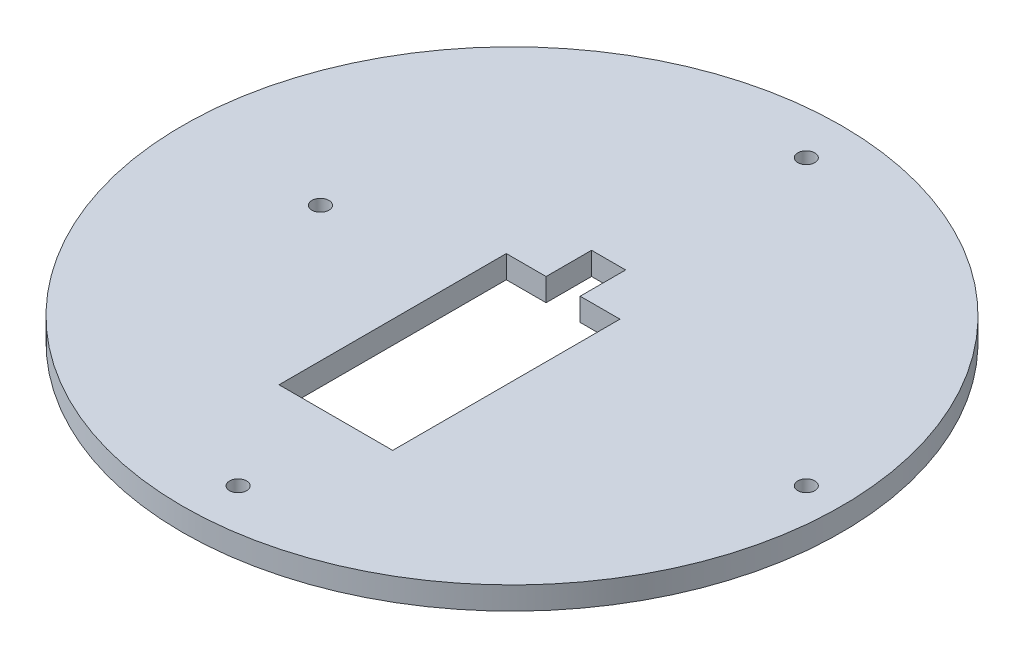
ISO-10303-21;
HEADER;
FILE_DESCRIPTION(('STEP AP214'),'2;1');
FILE_NAME('part.step','',(''),(''),'','','');
FILE_SCHEMA(('AUTOMOTIVE_DESIGN { 1 0 10303 214 1 1 1 1 }'));
ENDSEC;
DATA;
#1=APPLICATION_CONTEXT('core data for automotive mechanical design processes');
#2=APPLICATION_PROTOCOL_DEFINITION('international standard','automotive_design',2000,#1);
#3=PRODUCT_CONTEXT('',#1,'mechanical');
#4=PRODUCT('Part','Part','',(#3));
#5=PRODUCT_RELATED_PRODUCT_CATEGORY('part','',(#4));
#6=PRODUCT_DEFINITION_FORMATION('','',#4);
#7=PRODUCT_DEFINITION_CONTEXT('part definition',#1,'design');
#8=PRODUCT_DEFINITION('design','',#6,#7);
#9=PRODUCT_DEFINITION_SHAPE('','',#8);
#10=(LENGTH_UNIT() NAMED_UNIT(*) SI_UNIT(.MILLI.,.METRE.));
#11=(NAMED_UNIT(*) PLANE_ANGLE_UNIT() SI_UNIT($,.RADIAN.));
#12=(NAMED_UNIT(*) SI_UNIT($,.STERADIAN.) SOLID_ANGLE_UNIT());
#13=UNCERTAINTY_MEASURE_WITH_UNIT(LENGTH_MEASURE(1.E-05),#10,'distance_accuracy_value','');
#14=(GEOMETRIC_REPRESENTATION_CONTEXT(3) GLOBAL_UNCERTAINTY_ASSIGNED_CONTEXT((#13)) GLOBAL_UNIT_ASSIGNED_CONTEXT((#10,
#11,#12)) REPRESENTATION_CONTEXT('',''));
#15=CARTESIAN_POINT('',(0.,0.,0.));
#16=DIRECTION('',(0.,0.,1.));
#17=DIRECTION('',(1.,0.,0.));
#18=AXIS2_PLACEMENT_3D('',#15,#16,#17);
#19=CARTESIAN_POINT('',(0.,4.,0.));
#20=DIRECTION('',(0.,-1.,0.));
#21=DIRECTION('',(0.,0.,-1.));
#22=AXIS2_PLACEMENT_3D('',#19,#20,#21);
#23=CYLINDRICAL_SURFACE('',#22,58.);
#24=CARTESIAN_POINT('',(0.,4.,0.));
#25=DIRECTION('',(0.,1.,0.));
#26=DIRECTION('',(0.,0.,1.));
#27=AXIS2_PLACEMENT_3D('',#24,#25,#26);
#28=CIRCLE('',#27,58.);
#29=CARTESIAN_POINT('',(0.,4.,58.));
#30=VERTEX_POINT('',#29);
#31=EDGE_CURVE('E174',#30,#30,#28,.T.);
#32=ORIENTED_EDGE('',*,*,#31,.F.);
#33=EDGE_LOOP('',(#32));
#34=FACE_BOUND('',#33,.T.);
#35=CARTESIAN_POINT('',(0.,0.,0.));
#36=DIRECTION('',(0.,1.,0.));
#37=DIRECTION('',(0.,0.,1.));
#38=AXIS2_PLACEMENT_3D('',#35,#36,#37);
#39=CIRCLE('',#38,58.);
#40=CARTESIAN_POINT('',(0.,0.,58.));
#41=VERTEX_POINT('',#40);
#42=EDGE_CURVE('E173',#41,#41,#39,.T.);
#43=ORIENTED_EDGE('',*,*,#42,.T.);
#44=EDGE_LOOP('',(#43));
#45=FACE_BOUND('',#44,.T.);
#46=ADVANCED_FACE('F36',(#34,#45),#23,.T.);
#47=CARTESIAN_POINT('',(0.,4.,0.));
#48=DIRECTION('',(0.,1.,0.));
#49=DIRECTION('',(0.,0.,1.));
#50=AXIS2_PLACEMENT_3D('',#47,#48,#49);
#51=PLANE('',#50);
#52=DIRECTION('',(0.,0.,-1.));
#53=VECTOR('',#52,1.);
#54=CARTESIAN_POINT('',(10.,4.,31.));
#55=LINE('',#54,#53);
#56=CARTESIAN_POINT('',(10.,4.,31.));
#57=VERTEX_POINT('',#56);
#58=CARTESIAN_POINT('',(10.,4.,-9.));
#59=VERTEX_POINT('',#58);
#60=EDGE_CURVE('E50',#57,#59,#55,.T.);
#61=ORIENTED_EDGE('',*,*,#60,.F.);
#62=DIRECTION('',(1.,0.,0.));
#63=VECTOR('',#62,1.);
#64=CARTESIAN_POINT('',(-9.99999999999997,4.,31.));
#65=LINE('',#64,#63);
#66=CARTESIAN_POINT('',(-9.99999999999997,4.,31.));
#67=VERTEX_POINT('',#66);
#68=EDGE_CURVE('E134',#67,#57,#65,.T.);
#69=ORIENTED_EDGE('',*,*,#68,.F.);
#70=DIRECTION('',(0.,0.,1.));
#71=VECTOR('',#70,1.);
#72=CARTESIAN_POINT('',(-9.99999999999997,4.,31.));
#73=LINE('',#72,#71);
#74=CARTESIAN_POINT('',(-9.99999999999997,4.,-9.));
#75=VERTEX_POINT('',#74);
#76=EDGE_CURVE('E131',#75,#67,#73,.T.);
#77=ORIENTED_EDGE('',*,*,#76,.F.);
#78=DIRECTION('',(-1.,0.,0.));
#79=VECTOR('',#78,1.);
#80=CARTESIAN_POINT('',(-9.99999999999997,4.,-9.));
#81=LINE('',#80,#79);
#82=CARTESIAN_POINT('',(-2.99999999999997,4.,-9.));
#83=VERTEX_POINT('',#82);
#84=EDGE_CURVE('E128',#83,#75,#81,.T.);
#85=ORIENTED_EDGE('',*,*,#84,.F.);
#86=DIRECTION('',(0.,0.,1.));
#87=VECTOR('',#86,1.);
#88=CARTESIAN_POINT('',(-2.99999999999997,4.,-9.));
#89=LINE('',#88,#87);
#90=CARTESIAN_POINT('',(-2.99999999999997,4.,-17.));
#91=VERTEX_POINT('',#90);
#92=EDGE_CURVE('E122',#91,#83,#89,.T.);
#93=ORIENTED_EDGE('',*,*,#92,.F.);
#94=DIRECTION('',(-1.,0.,0.));
#95=VECTOR('',#94,1.);
#96=CARTESIAN_POINT('',(-2.99999999999997,4.,-17.));
#97=LINE('',#96,#95);
#98=CARTESIAN_POINT('',(3.00000000000003,4.,-17.));
#99=VERTEX_POINT('',#98);
#100=EDGE_CURVE('E120',#99,#91,#97,.T.);
#101=ORIENTED_EDGE('',*,*,#100,.F.);
#102=DIRECTION('',(0.,0.,-1.));
#103=VECTOR('',#102,1.);
#104=CARTESIAN_POINT('',(3.00000000000003,4.,-9.));
#105=LINE('',#104,#103);
#106=CARTESIAN_POINT('',(3.00000000000003,4.,-9.));
#107=VERTEX_POINT('',#106);
#108=EDGE_CURVE('E103',#107,#99,#105,.T.);
#109=ORIENTED_EDGE('',*,*,#108,.F.);
#110=DIRECTION('',(-1.,0.,0.));
#111=VECTOR('',#110,1.);
#112=CARTESIAN_POINT('',(3.00000000000003,4.,-9.));
#113=LINE('',#112,#111);
#114=EDGE_CURVE('E112',#59,#107,#113,.T.);
#115=ORIENTED_EDGE('',*,*,#114,.F.);
#116=EDGE_LOOP('',(#61,#69,#77,#85,#93,#101,#109,#115));
#117=FACE_BOUND('',#116,.T.);
#118=CARTESIAN_POINT('',(1.79336649678,4.,-50.));
#119=DIRECTION('',(0.,1.,0.));
#120=DIRECTION('',(0.,0.,1.));
#121=AXIS2_PLACEMENT_3D('',#118,#119,#120);
#122=CIRCLE('',#121,1.5);
#123=CARTESIAN_POINT('',(1.79336649678,4.,-48.5));
#124=VERTEX_POINT('',#123);
#125=EDGE_CURVE('E170',#124,#124,#122,.T.);
#126=ORIENTED_EDGE('',*,*,#125,.F.);
#127=EDGE_LOOP('',(#126));
#128=FACE_BOUND('',#127,.T.);
#129=CARTESIAN_POINT('',(-33.70663350322,4.,0.));
#130=DIRECTION('',(0.,1.,0.));
#131=DIRECTION('',(0.,0.,1.));
#132=AXIS2_PLACEMENT_3D('',#129,#130,#131);
#133=CIRCLE('',#132,1.5);
#134=CARTESIAN_POINT('',(-33.70663350322,4.,1.5));
#135=VERTEX_POINT('',#134);
#136=EDGE_CURVE('E167',#135,#135,#133,.T.);
#137=ORIENTED_EDGE('',*,*,#136,.F.);
#138=EDGE_LOOP('',(#137));
#139=FACE_BOUND('',#138,.T.);
#140=CARTESIAN_POINT('',(1.79336649678,4.,50.));
#141=DIRECTION('',(0.,1.,0.));
#142=DIRECTION('',(0.,0.,1.));
#143=AXIS2_PLACEMENT_3D('',#140,#141,#142);
#144=CIRCLE('',#143,1.5);
#145=CARTESIAN_POINT('',(1.79336649678,4.,51.5));
#146=VERTEX_POINT('',#145);
#147=EDGE_CURVE('E164',#146,#146,#144,.T.);
#148=ORIENTED_EDGE('',*,*,#147,.F.);
#149=EDGE_LOOP('',(#148));
#150=FACE_BOUND('',#149,.T.);
#151=CARTESIAN_POINT('',(51.79336649678,4.,0.));
#152=DIRECTION('',(0.,1.,0.));
#153=DIRECTION('',(0.,0.,1.));
#154=AXIS2_PLACEMENT_3D('',#151,#152,#153);
#155=CIRCLE('',#154,1.5);
#156=CARTESIAN_POINT('',(51.79336649678,4.,1.5));
#157=VERTEX_POINT('',#156);
#158=EDGE_CURVE('E153',#157,#157,#155,.T.);
#159=ORIENTED_EDGE('',*,*,#158,.F.);
#160=EDGE_LOOP('',(#159));
#161=FACE_BOUND('',#160,.T.);
#162=ORIENTED_EDGE('',*,*,#31,.T.);
#163=EDGE_LOOP('',(#162));
#164=FACE_BOUND('',#163,.T.);
#165=ADVANCED_FACE('F116',(#117,#128,#139,#150,#161,#164),#51,.T.);
#166=CARTESIAN_POINT('',(0.,0.,0.));
#167=DIRECTION('',(0.,1.,0.));
#168=DIRECTION('',(0.,0.,1.));
#169=AXIS2_PLACEMENT_3D('',#166,#167,#168);
#170=PLANE('',#169);
#171=DIRECTION('',(1.,0.,0.));
#172=VECTOR('',#171,1.);
#173=CARTESIAN_POINT('',(0.,0.,31.));
#174=LINE('',#173,#172);
#175=CARTESIAN_POINT('',(-9.99999999999997,0.,31.));
#176=VERTEX_POINT('',#175);
#177=CARTESIAN_POINT('',(10.,0.,31.));
#178=VERTEX_POINT('',#177);
#179=EDGE_CURVE('E43',#176,#178,#174,.T.);
#180=ORIENTED_EDGE('',*,*,#179,.T.);
#181=DIRECTION('',(0.,0.,-1.));
#182=VECTOR('',#181,1.);
#183=CARTESIAN_POINT('',(10.,0.,0.));
#184=LINE('',#183,#182);
#185=CARTESIAN_POINT('',(10.,0.,-9.));
#186=VERTEX_POINT('',#185);
#187=EDGE_CURVE('E11',#178,#186,#184,.T.);
#188=ORIENTED_EDGE('',*,*,#187,.T.);
#189=DIRECTION('',(-1.,0.,0.));
#190=VECTOR('',#189,1.);
#191=CARTESIAN_POINT('',(0.,0.,-9.));
#192=LINE('',#191,#190);
#193=CARTESIAN_POINT('',(3.00000000000003,0.,-9.));
#194=VERTEX_POINT('',#193);
#195=EDGE_CURVE('E177',#186,#194,#192,.T.);
#196=ORIENTED_EDGE('',*,*,#195,.T.);
#197=DIRECTION('',(0.,0.,-1.));
#198=VECTOR('',#197,1.);
#199=CARTESIAN_POINT('',(3.00000000000003,0.,0.));
#200=LINE('',#199,#198);
#201=CARTESIAN_POINT('',(3.00000000000003,0.,-17.));
#202=VERTEX_POINT('',#201);
#203=EDGE_CURVE('E106',#194,#202,#200,.T.);
#204=ORIENTED_EDGE('',*,*,#203,.T.);
#205=DIRECTION('',(-1.,0.,0.));
#206=VECTOR('',#205,1.);
#207=CARTESIAN_POINT('',(0.,0.,-17.));
#208=LINE('',#207,#206);
#209=CARTESIAN_POINT('',(-2.99999999999997,0.,-17.));
#210=VERTEX_POINT('',#209);
#211=EDGE_CURVE('E182',#202,#210,#208,.T.);
#212=ORIENTED_EDGE('',*,*,#211,.T.);
#213=DIRECTION('',(0.,0.,1.));
#214=VECTOR('',#213,1.);
#215=CARTESIAN_POINT('',(-2.99999999999997,0.,0.));
#216=LINE('',#215,#214);
#217=CARTESIAN_POINT('',(-2.99999999999997,0.,-9.));
#218=VERTEX_POINT('',#217);
#219=EDGE_CURVE('E185',#210,#218,#216,.T.);
#220=ORIENTED_EDGE('',*,*,#219,.T.);
#221=DIRECTION('',(-1.,0.,0.));
#222=VECTOR('',#221,1.);
#223=CARTESIAN_POINT('',(0.,0.,-9.));
#224=LINE('',#223,#222);
#225=CARTESIAN_POINT('',(-9.99999999999997,0.,-9.));
#226=VERTEX_POINT('',#225);
#227=EDGE_CURVE('E188',#218,#226,#224,.T.);
#228=ORIENTED_EDGE('',*,*,#227,.T.);
#229=DIRECTION('',(0.,0.,1.));
#230=VECTOR('',#229,1.);
#231=CARTESIAN_POINT('',(-9.99999999999997,0.,0.));
#232=LINE('',#231,#230);
#233=EDGE_CURVE('E191',#226,#176,#232,.T.);
#234=ORIENTED_EDGE('',*,*,#233,.T.);
#235=EDGE_LOOP('',(#180,#188,#196,#204,#212,#220,#228,#234));
#236=FACE_BOUND('',#235,.T.);
#237=CARTESIAN_POINT('',(1.79336649678,0.,-50.));
#238=DIRECTION('',(0.,-1.,0.));
#239=DIRECTION('',(0.,0.,-1.));
#240=AXIS2_PLACEMENT_3D('',#237,#238,#239);
#241=CIRCLE('',#240,1.5);
#242=CARTESIAN_POINT('',(1.79336649678,0.,-51.5));
#243=VERTEX_POINT('',#242);
#244=EDGE_CURVE('E150',#243,#243,#241,.T.);
#245=ORIENTED_EDGE('',*,*,#244,.F.);
#246=EDGE_LOOP('',(#245));
#247=FACE_BOUND('',#246,.T.);
#248=CARTESIAN_POINT('',(-33.70663350322,0.,0.));
#249=DIRECTION('',(0.,-1.,0.));
#250=DIRECTION('',(0.,0.,-1.));
#251=AXIS2_PLACEMENT_3D('',#248,#249,#250);
#252=CIRCLE('',#251,1.5);
#253=CARTESIAN_POINT('',(-33.70663350322,0.,-1.5));
#254=VERTEX_POINT('',#253);
#255=EDGE_CURVE('E154',#254,#254,#252,.T.);
#256=ORIENTED_EDGE('',*,*,#255,.F.);
#257=EDGE_LOOP('',(#256));
#258=FACE_BOUND('',#257,.T.);
#259=CARTESIAN_POINT('',(1.79336649678,0.,50.));
#260=DIRECTION('',(0.,-1.,0.));
#261=DIRECTION('',(0.,0.,-1.));
#262=AXIS2_PLACEMENT_3D('',#259,#260,#261);
#263=CIRCLE('',#262,1.5);
#264=CARTESIAN_POINT('',(1.79336649678,0.,48.5));
#265=VERTEX_POINT('',#264);
#266=EDGE_CURVE('E157',#265,#265,#263,.T.);
#267=ORIENTED_EDGE('',*,*,#266,.F.);
#268=EDGE_LOOP('',(#267));
#269=FACE_BOUND('',#268,.T.);
#270=CARTESIAN_POINT('',(51.79336649678,0.,0.));
#271=DIRECTION('',(0.,-1.,0.));
#272=DIRECTION('',(0.,0.,-1.));
#273=AXIS2_PLACEMENT_3D('',#270,#271,#272);
#274=CIRCLE('',#273,1.5);
#275=CARTESIAN_POINT('',(51.79336649678,0.,-1.5));
#276=VERTEX_POINT('',#275);
#277=EDGE_CURVE('E139',#276,#276,#274,.T.);
#278=ORIENTED_EDGE('',*,*,#277,.F.);
#279=EDGE_LOOP('',(#278));
#280=FACE_BOUND('',#279,.T.);
#281=ORIENTED_EDGE('',*,*,#42,.F.);
#282=EDGE_LOOP('',(#281));
#283=FACE_BOUND('',#282,.T.);
#284=ADVANCED_FACE('F195',(#236,#247,#258,#269,#280,#283),#170,.F.);
#285=CARTESIAN_POINT('',(51.79336649678,50.,0.));
#286=DIRECTION('',(0.,-1.,0.));
#287=DIRECTION('',(0.,0.,-1.));
#288=AXIS2_PLACEMENT_3D('',#285,#286,#287);
#289=CYLINDRICAL_SURFACE('',#288,1.5);
#290=ORIENTED_EDGE('',*,*,#158,.T.);
#291=EDGE_LOOP('',(#290));
#292=FACE_BOUND('',#291,.T.);
#293=ORIENTED_EDGE('',*,*,#277,.T.);
#294=EDGE_LOOP('',(#293));
#295=FACE_BOUND('',#294,.T.);
#296=ADVANCED_FACE('F239',(#292,#295),#289,.F.);
#297=CARTESIAN_POINT('',(1.79336649678,50.,50.));
#298=DIRECTION('',(0.,-1.,0.));
#299=DIRECTION('',(0.,0.,-1.));
#300=AXIS2_PLACEMENT_3D('',#297,#298,#299);
#301=CYLINDRICAL_SURFACE('',#300,1.5);
#302=ORIENTED_EDGE('',*,*,#147,.T.);
#303=EDGE_LOOP('',(#302));
#304=FACE_BOUND('',#303,.T.);
#305=ORIENTED_EDGE('',*,*,#266,.T.);
#306=EDGE_LOOP('',(#305));
#307=FACE_BOUND('',#306,.T.);
#308=ADVANCED_FACE('F243',(#304,#307),#301,.F.);
#309=CARTESIAN_POINT('',(-33.70663350322,50.,0.));
#310=DIRECTION('',(0.,-1.,0.));
#311=DIRECTION('',(0.,0.,-1.));
#312=AXIS2_PLACEMENT_3D('',#309,#310,#311);
#313=CYLINDRICAL_SURFACE('',#312,1.5);
#314=ORIENTED_EDGE('',*,*,#136,.T.);
#315=EDGE_LOOP('',(#314));
#316=FACE_BOUND('',#315,.T.);
#317=ORIENTED_EDGE('',*,*,#255,.T.);
#318=EDGE_LOOP('',(#317));
#319=FACE_BOUND('',#318,.T.);
#320=ADVANCED_FACE('F224',(#316,#319),#313,.F.);
#321=CARTESIAN_POINT('',(1.79336649678,50.,-50.));
#322=DIRECTION('',(0.,-1.,0.));
#323=DIRECTION('',(0.,0.,-1.));
#324=AXIS2_PLACEMENT_3D('',#321,#322,#323);
#325=CYLINDRICAL_SURFACE('',#324,1.5);
#326=ORIENTED_EDGE('',*,*,#125,.T.);
#327=EDGE_LOOP('',(#326));
#328=FACE_BOUND('',#327,.T.);
#329=ORIENTED_EDGE('',*,*,#244,.T.);
#330=EDGE_LOOP('',(#329));
#331=FACE_BOUND('',#330,.T.);
#332=ADVANCED_FACE('F217',(#328,#331),#325,.F.);
#333=CARTESIAN_POINT('',(10.,-496.,31.));
#334=DIRECTION('',(1.,0.,0.));
#335=DIRECTION('',(0.,0.,-1.));
#336=AXIS2_PLACEMENT_3D('',#333,#334,#335);
#337=PLANE('',#336);
#338=DIRECTION('',(0.,1.,0.));
#339=VECTOR('',#338,1.);
#340=CARTESIAN_POINT('',(10.,-496.,31.));
#341=LINE('',#340,#339);
#342=EDGE_CURVE('E137',#178,#57,#341,.T.);
#343=ORIENTED_EDGE('',*,*,#342,.T.);
#344=ORIENTED_EDGE('',*,*,#60,.T.);
#345=DIRECTION('',(0.,1.,0.));
#346=VECTOR('',#345,1.);
#347=CARTESIAN_POINT('',(10.,-496.,-9.));
#348=LINE('',#347,#346);
#349=EDGE_CURVE('E109',#186,#59,#348,.T.);
#350=ORIENTED_EDGE('',*,*,#349,.F.);
#351=ORIENTED_EDGE('',*,*,#187,.F.);
#352=EDGE_LOOP('',(#343,#344,#350,#351));
#353=FACE_BOUND('',#352,.T.);
#354=ADVANCED_FACE('F215',(#353),#337,.F.);
#355=CARTESIAN_POINT('',(-9.99999999999997,-496.,31.));
#356=DIRECTION('',(0.,0.,1.));
#357=DIRECTION('',(1.,0.,0.));
#358=AXIS2_PLACEMENT_3D('',#355,#356,#357);
#359=PLANE('',#358);
#360=DIRECTION('',(0.,1.,0.));
#361=VECTOR('',#360,1.);
#362=CARTESIAN_POINT('',(-9.99999999999997,-496.,31.));
#363=LINE('',#362,#361);
#364=EDGE_CURVE('E140',#176,#67,#363,.T.);
#365=ORIENTED_EDGE('',*,*,#364,.T.);
#366=ORIENTED_EDGE('',*,*,#68,.T.);
#367=ORIENTED_EDGE('',*,*,#342,.F.);
#368=ORIENTED_EDGE('',*,*,#179,.F.);
#369=EDGE_LOOP('',(#365,#366,#367,#368));
#370=FACE_BOUND('',#369,.T.);
#371=ADVANCED_FACE('F200',(#370),#359,.F.);
#372=CARTESIAN_POINT('',(-9.99999999999997,-496.,31.));
#373=DIRECTION('',(-1.,0.,0.));
#374=DIRECTION('',(0.,0.,1.));
#375=AXIS2_PLACEMENT_3D('',#372,#373,#374);
#376=PLANE('',#375);
#377=DIRECTION('',(0.,1.,0.));
#378=VECTOR('',#377,1.);
#379=CARTESIAN_POINT('',(-9.99999999999997,-496.,-9.));
#380=LINE('',#379,#378);
#381=EDGE_CURVE('E142',#226,#75,#380,.T.);
#382=ORIENTED_EDGE('',*,*,#381,.T.);
#383=ORIENTED_EDGE('',*,*,#76,.T.);
#384=ORIENTED_EDGE('',*,*,#364,.F.);
#385=ORIENTED_EDGE('',*,*,#233,.F.);
#386=EDGE_LOOP('',(#382,#383,#384,#385));
#387=FACE_BOUND('',#386,.T.);
#388=ADVANCED_FACE('F202',(#387),#376,.F.);
#389=CARTESIAN_POINT('',(-9.99999999999997,-496.,-9.));
#390=DIRECTION('',(0.,0.,-1.));
#391=DIRECTION('',(-1.,0.,0.));
#392=AXIS2_PLACEMENT_3D('',#389,#390,#391);
#393=PLANE('',#392);
#394=DIRECTION('',(0.,1.,0.));
#395=VECTOR('',#394,1.);
#396=CARTESIAN_POINT('',(-2.99999999999997,-496.,-9.));
#397=LINE('',#396,#395);
#398=EDGE_CURVE('E144',#218,#83,#397,.T.);
#399=ORIENTED_EDGE('',*,*,#398,.T.);
#400=ORIENTED_EDGE('',*,*,#84,.T.);
#401=ORIENTED_EDGE('',*,*,#381,.F.);
#402=ORIENTED_EDGE('',*,*,#227,.F.);
#403=EDGE_LOOP('',(#399,#400,#401,#402));
#404=FACE_BOUND('',#403,.T.);
#405=ADVANCED_FACE('F208',(#404),#393,.F.);
#406=CARTESIAN_POINT('',(-2.99999999999997,-496.,-9.));
#407=DIRECTION('',(-1.,0.,0.));
#408=DIRECTION('',(0.,0.,1.));
#409=AXIS2_PLACEMENT_3D('',#406,#407,#408);
#410=PLANE('',#409);
#411=DIRECTION('',(0.,1.,0.));
#412=VECTOR('',#411,1.);
#413=CARTESIAN_POINT('',(-2.99999999999997,-496.,-17.));
#414=LINE('',#413,#412);
#415=EDGE_CURVE('E146',#210,#91,#414,.T.);
#416=ORIENTED_EDGE('',*,*,#415,.T.);
#417=ORIENTED_EDGE('',*,*,#92,.T.);
#418=ORIENTED_EDGE('',*,*,#398,.F.);
#419=ORIENTED_EDGE('',*,*,#219,.F.);
#420=EDGE_LOOP('',(#416,#417,#418,#419));
#421=FACE_BOUND('',#420,.T.);
#422=ADVANCED_FACE('F211',(#421),#410,.F.);
#423=CARTESIAN_POINT('',(-2.99999999999997,-496.,-17.));
#424=DIRECTION('',(0.,0.,-1.));
#425=DIRECTION('',(-1.,0.,0.));
#426=AXIS2_PLACEMENT_3D('',#423,#424,#425);
#427=PLANE('',#426);
#428=DIRECTION('',(0.,1.,0.));
#429=VECTOR('',#428,1.);
#430=CARTESIAN_POINT('',(3.00000000000003,-496.,-17.));
#431=LINE('',#430,#429);
#432=EDGE_CURVE('E108',#202,#99,#431,.T.);
#433=ORIENTED_EDGE('',*,*,#432,.T.);
#434=ORIENTED_EDGE('',*,*,#100,.T.);
#435=ORIENTED_EDGE('',*,*,#415,.F.);
#436=ORIENTED_EDGE('',*,*,#211,.F.);
#437=EDGE_LOOP('',(#433,#434,#435,#436));
#438=FACE_BOUND('',#437,.T.);
#439=ADVANCED_FACE('F214',(#438),#427,.F.);
#440=CARTESIAN_POINT('',(3.00000000000003,-496.,-9.));
#441=DIRECTION('',(1.,0.,0.));
#442=DIRECTION('',(0.,0.,-1.));
#443=AXIS2_PLACEMENT_3D('',#440,#441,#442);
#444=PLANE('',#443);
#445=DIRECTION('',(0.,1.,0.));
#446=VECTOR('',#445,1.);
#447=CARTESIAN_POINT('',(3.00000000000003,-496.,-9.));
#448=LINE('',#447,#446);
#449=EDGE_CURVE('E58',#194,#107,#448,.T.);
#450=ORIENTED_EDGE('',*,*,#449,.T.);
#451=ORIENTED_EDGE('',*,*,#108,.T.);
#452=ORIENTED_EDGE('',*,*,#432,.F.);
#453=ORIENTED_EDGE('',*,*,#203,.F.);
#454=EDGE_LOOP('',(#450,#451,#452,#453));
#455=FACE_BOUND('',#454,.T.);
#456=ADVANCED_FACE('F100',(#455),#444,.F.);
#457=CARTESIAN_POINT('',(3.00000000000003,-496.,-9.));
#458=DIRECTION('',(0.,0.,-1.));
#459=DIRECTION('',(-1.,0.,0.));
#460=AXIS2_PLACEMENT_3D('',#457,#458,#459);
#461=PLANE('',#460);
#462=ORIENTED_EDGE('',*,*,#349,.T.);
#463=ORIENTED_EDGE('',*,*,#114,.T.);
#464=ORIENTED_EDGE('',*,*,#449,.F.);
#465=ORIENTED_EDGE('',*,*,#195,.F.);
#466=EDGE_LOOP('',(#462,#463,#464,#465));
#467=FACE_BOUND('',#466,.T.);
#468=ADVANCED_FACE('F113',(#467),#461,.F.);
#469=CLOSED_SHELL('',(#46,#165,#284,#296,#308,#320,#332,#354,#371,#388,#405,#422,#439,#456,#468));
#470=MANIFOLD_SOLID_BREP('B2',#469);
#471=ADVANCED_BREP_SHAPE_REPRESENTATION('',(#18,#470),#14);
#472=SHAPE_DEFINITION_REPRESENTATION(#9,#471);
ENDSEC;
END-ISO-10303-21;
